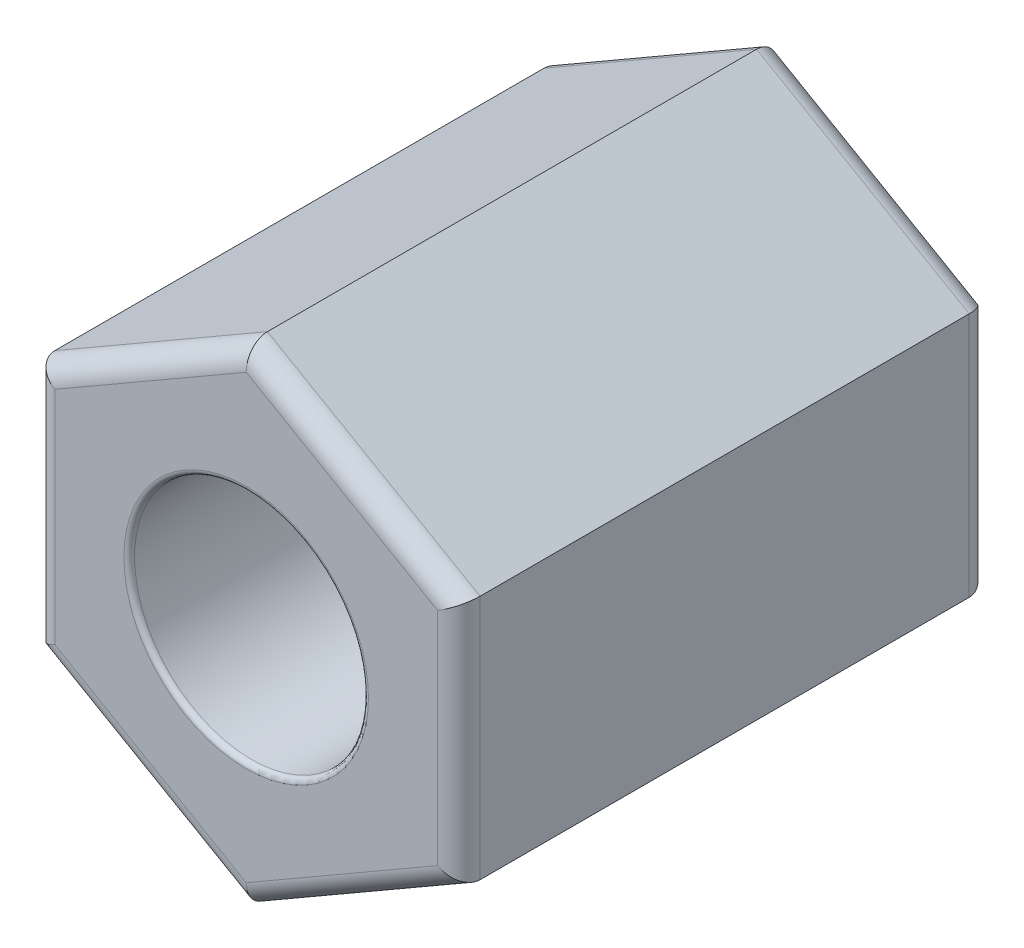
ISO-10303-21;
HEADER;
FILE_DESCRIPTION(('STEP AP214'),'2;1');
FILE_NAME('part.step','',(''),(''),'','','');
FILE_SCHEMA(('AUTOMOTIVE_DESIGN { 1 0 10303 214 1 1 1 1 }'));
ENDSEC;
DATA;
#1=APPLICATION_CONTEXT('core data for automotive mechanical design processes');
#2=APPLICATION_PROTOCOL_DEFINITION('international standard','automotive_design',2000,#1);
#3=PRODUCT_CONTEXT('',#1,'mechanical');
#4=PRODUCT('Part','Part','',(#3));
#5=PRODUCT_RELATED_PRODUCT_CATEGORY('part','',(#4));
#6=PRODUCT_DEFINITION_FORMATION('','',#4);
#7=PRODUCT_DEFINITION_CONTEXT('part definition',#1,'design');
#8=PRODUCT_DEFINITION('design','',#6,#7);
#9=PRODUCT_DEFINITION_SHAPE('','',#8);
#10=(LENGTH_UNIT() NAMED_UNIT(*) SI_UNIT(.MILLI.,.METRE.));
#11=(NAMED_UNIT(*) PLANE_ANGLE_UNIT() SI_UNIT($,.RADIAN.));
#12=(NAMED_UNIT(*) SI_UNIT($,.STERADIAN.) SOLID_ANGLE_UNIT());
#13=UNCERTAINTY_MEASURE_WITH_UNIT(LENGTH_MEASURE(1.E-05),#10,'distance_accuracy_value','');
#14=(GEOMETRIC_REPRESENTATION_CONTEXT(3) GLOBAL_UNCERTAINTY_ASSIGNED_CONTEXT((#13)) GLOBAL_UNIT_ASSIGNED_CONTEXT((#10,
#11,#12)) REPRESENTATION_CONTEXT('',''));
#15=CARTESIAN_POINT('',(0.,0.,0.));
#16=DIRECTION('',(0.,0.,1.));
#17=DIRECTION('',(1.,0.,0.));
#18=AXIS2_PLACEMENT_3D('',#15,#16,#17);
#19=CARTESIAN_POINT('',(0.,0.,50.));
#20=DIRECTION('',(0.,0.,1.));
#21=DIRECTION('',(1.,0.,0.));
#22=AXIS2_PLACEMENT_3D('',#19,#20,#21);
#23=PLANE('',#22);
#24=CARTESIAN_POINT('',(0.,0.,50.));
#25=DIRECTION('',(0.,0.,1.));
#26=DIRECTION('',(1.,0.,0.));
#27=AXIS2_PLACEMENT_3D('',#24,#25,#26);
#28=CIRCLE('',#27,11.5);
#29=CARTESIAN_POINT('',(11.5,0.,50.));
#30=VERTEX_POINT('',#29);
#31=EDGE_CURVE('E11',#30,#30,#28,.F.);
#32=ORIENTED_EDGE('',*,*,#31,.T.);
#33=EDGE_LOOP('',(#32));
#34=FACE_BOUND('',#33,.T.);
#35=DIRECTION('',(0.866025403784439,0.5,0.));
#36=VECTOR('',#35,1.);
#37=CARTESIAN_POINT('',(19.,-9.81495457622363,50.));
#38=LINE('',#37,#36);
#39=CARTESIAN_POINT('',(0.,-20.7846096908265,50.));
#40=VERTEX_POINT('',#39);
#41=CARTESIAN_POINT('',(18.,-10.3923048454133,50.));
#42=VERTEX_POINT('',#41);
#43=EDGE_CURVE('E49',#40,#42,#38,.T.);
#44=ORIENTED_EDGE('',*,*,#43,.T.);
#45=DIRECTION('',(0.,1.,0.));
#46=VECTOR('',#45,1.);
#47=CARTESIAN_POINT('',(18.,11.5470053837925,50.));
#48=LINE('',#47,#46);
#49=CARTESIAN_POINT('',(18.,10.3923048454133,50.));
#50=VERTEX_POINT('',#49);
#51=EDGE_CURVE('E129',#42,#50,#48,.T.);
#52=ORIENTED_EDGE('',*,*,#51,.T.);
#53=DIRECTION('',(-0.866025403784438,0.5,0.));
#54=VECTOR('',#53,1.);
#55=CARTESIAN_POINT('',(-0.999999999999987,21.3619599600162,50.));
#56=LINE('',#55,#54);
#57=CARTESIAN_POINT('',(0.,20.7846096908265,50.));
#58=VERTEX_POINT('',#57);
#59=EDGE_CURVE('E194',#50,#58,#56,.T.);
#60=ORIENTED_EDGE('',*,*,#59,.T.);
#61=DIRECTION('',(-0.866025403784439,-0.5,0.));
#62=VECTOR('',#61,1.);
#63=CARTESIAN_POINT('',(-19.,9.81495457622363,50.));
#64=LINE('',#63,#62);
#65=CARTESIAN_POINT('',(-18.,10.3923048454133,50.));
#66=VERTEX_POINT('',#65);
#67=EDGE_CURVE('E196',#58,#66,#64,.T.);
#68=ORIENTED_EDGE('',*,*,#67,.T.);
#69=DIRECTION('',(0.,-1.,0.));
#70=VECTOR('',#69,1.);
#71=CARTESIAN_POINT('',(-18.,-11.5470053837925,50.));
#72=LINE('',#71,#70);
#73=CARTESIAN_POINT('',(-18.,-10.3923048454133,50.));
#74=VERTEX_POINT('',#73);
#75=EDGE_CURVE('E198',#66,#74,#72,.T.);
#76=ORIENTED_EDGE('',*,*,#75,.T.);
#77=DIRECTION('',(0.866025403784439,-0.5,0.));
#78=VECTOR('',#77,1.);
#79=CARTESIAN_POINT('',(0.999999999999984,-21.3619599600162,50.));
#80=LINE('',#79,#78);
#81=EDGE_CURVE('E54',#74,#40,#80,.T.);
#82=ORIENTED_EDGE('',*,*,#81,.T.);
#83=EDGE_LOOP('',(#44,#52,#60,#68,#76,#82));
#84=FACE_BOUND('',#83,.T.);
#85=ADVANCED_FACE('F34',(#34,#84),#23,.T.);
#86=CARTESIAN_POINT('',(0.,0.,0.));
#87=DIRECTION('',(0.,0.,1.));
#88=DIRECTION('',(1.,0.,0.));
#89=AXIS2_PLACEMENT_3D('',#86,#87,#88);
#90=PLANE('',#89);
#91=CARTESIAN_POINT('',(0.,0.,0.));
#92=DIRECTION('',(0.,0.,1.));
#93=DIRECTION('',(1.,0.,0.));
#94=AXIS2_PLACEMENT_3D('',#91,#92,#93);
#95=CIRCLE('',#94,11.5);
#96=CARTESIAN_POINT('',(11.5,0.,0.));
#97=VERTEX_POINT('',#96);
#98=EDGE_CURVE('E203',#97,#97,#95,.T.);
#99=ORIENTED_EDGE('',*,*,#98,.T.);
#100=EDGE_LOOP('',(#99));
#101=FACE_BOUND('',#100,.T.);
#102=DIRECTION('',(0.,1.,0.));
#103=VECTOR('',#102,1.);
#104=CARTESIAN_POINT('',(18.,0.,0.));
#105=LINE('',#104,#103);
#106=CARTESIAN_POINT('',(18.,10.3923048454133,0.));
#107=VERTEX_POINT('',#106);
#108=CARTESIAN_POINT('',(18.,-10.3923048454133,0.));
#109=VERTEX_POINT('',#108);
#110=EDGE_CURVE('E165',#107,#109,#105,.F.);
#111=ORIENTED_EDGE('',*,*,#110,.T.);
#112=DIRECTION('',(0.866025403784439,0.5,0.));
#113=VECTOR('',#112,1.);
#114=CARTESIAN_POINT('',(9.00000000000001,-15.5884572681199,0.));
#115=LINE('',#114,#113);
#116=CARTESIAN_POINT('',(0.,-20.7846096908265,0.));
#117=VERTEX_POINT('',#116);
#118=EDGE_CURVE('E175',#109,#117,#115,.F.);
#119=ORIENTED_EDGE('',*,*,#118,.T.);
#120=DIRECTION('',(0.866025403784439,-0.5,0.));
#121=VECTOR('',#120,1.);
#122=CARTESIAN_POINT('',(-9.00000000000001,-15.5884572681199,0.));
#123=LINE('',#122,#121);
#124=CARTESIAN_POINT('',(-18.,-10.3923048454133,0.));
#125=VERTEX_POINT('',#124);
#126=EDGE_CURVE('E173',#117,#125,#123,.F.);
#127=ORIENTED_EDGE('',*,*,#126,.T.);
#128=DIRECTION('',(0.,-1.,0.));
#129=VECTOR('',#128,1.);
#130=CARTESIAN_POINT('',(-18.,0.,0.));
#131=LINE('',#130,#129);
#132=CARTESIAN_POINT('',(-18.,10.3923048454133,0.));
#133=VERTEX_POINT('',#132);
#134=EDGE_CURVE('E171',#125,#133,#131,.F.);
#135=ORIENTED_EDGE('',*,*,#134,.T.);
#136=DIRECTION('',(-0.866025403784439,-0.5,0.));
#137=VECTOR('',#136,1.);
#138=CARTESIAN_POINT('',(-9.00000000000001,15.5884572681199,0.));
#139=LINE('',#138,#137);
#140=CARTESIAN_POINT('',(0.,20.7846096908265,0.));
#141=VERTEX_POINT('',#140);
#142=EDGE_CURVE('E169',#133,#141,#139,.F.);
#143=ORIENTED_EDGE('',*,*,#142,.T.);
#144=DIRECTION('',(-0.866025403784438,0.5,0.));
#145=VECTOR('',#144,1.);
#146=CARTESIAN_POINT('',(9.00000000000001,15.5884572681199,0.));
#147=LINE('',#146,#145);
#148=EDGE_CURVE('E167',#141,#107,#147,.F.);
#149=ORIENTED_EDGE('',*,*,#148,.T.);
#150=EDGE_LOOP('',(#111,#119,#127,#135,#143,#149));
#151=FACE_BOUND('',#150,.T.);
#152=ADVANCED_FACE('F246',(#101,#151),#90,.F.);
#153=CARTESIAN_POINT('',(-20.,-11.5470053837925,50.));
#154=DIRECTION('',(0.5,0.866025403784439,0.));
#155=DIRECTION('',(-0.866025403784439,0.5,0.));
#156=AXIS2_PLACEMENT_3D('',#153,#154,#155);
#157=PLANE('',#156);
#158=DIRECTION('',(0.,0.,-1.));
#159=VECTOR('',#158,1.);
#160=CARTESIAN_POINT('',(-20.,-11.5470053837925,50.));
#161=LINE('',#160,#159);
#162=CARTESIAN_POINT('',(-20.,-11.5470053837925,48.));
#163=VERTEX_POINT('',#162);
#164=CARTESIAN_POINT('',(-20.,-11.5470053837925,2.));
#165=VERTEX_POINT('',#164);
#166=EDGE_CURVE('E221',#163,#165,#161,.T.);
#167=ORIENTED_EDGE('',*,*,#166,.T.);
#168=DIRECTION('',(0.866025403784439,-0.5,0.));
#169=VECTOR('',#168,1.);
#170=CARTESIAN_POINT('',(-20.,-11.5470053837925,2.));
#171=LINE('',#170,#169);
#172=CARTESIAN_POINT('',(0.,-23.094010767585,2.));
#173=VERTEX_POINT('',#172);
#174=EDGE_CURVE('E180',#165,#173,#171,.T.);
#175=ORIENTED_EDGE('',*,*,#174,.T.);
#176=DIRECTION('',(0.,0.,-1.));
#177=VECTOR('',#176,1.);
#178=CARTESIAN_POINT('',(0.,-23.094010767585,50.));
#179=LINE('',#178,#177);
#180=CARTESIAN_POINT('',(0.,-23.094010767585,48.));
#181=VERTEX_POINT('',#180);
#182=EDGE_CURVE('E143',#181,#173,#179,.T.);
#183=ORIENTED_EDGE('',*,*,#182,.F.);
#184=DIRECTION('',(0.866025403784439,-0.5,0.));
#185=VECTOR('',#184,1.);
#186=CARTESIAN_POINT('',(-20.,-11.5470053837925,48.));
#187=LINE('',#186,#185);
#188=EDGE_CURVE('E178',#181,#163,#187,.F.);
#189=ORIENTED_EDGE('',*,*,#188,.T.);
#190=EDGE_LOOP('',(#167,#175,#183,#189));
#191=FACE_BOUND('',#190,.T.);
#192=ADVANCED_FACE('F249',(#191),#157,.F.);
#193=CARTESIAN_POINT('',(0.,-23.094010767585,50.));
#194=DIRECTION('',(-0.5,0.866025403784438,0.));
#195=DIRECTION('',(-0.866025403784439,-0.5,0.));
#196=AXIS2_PLACEMENT_3D('',#193,#194,#195);
#197=PLANE('',#196);
#198=ORIENTED_EDGE('',*,*,#182,.T.);
#199=DIRECTION('',(0.866025403784439,0.5,0.));
#200=VECTOR('',#199,1.);
#201=CARTESIAN_POINT('',(0.,-23.094010767585,2.));
#202=LINE('',#201,#200);
#203=CARTESIAN_POINT('',(20.,-11.5470053837925,2.));
#204=VERTEX_POINT('',#203);
#205=EDGE_CURVE('E142',#173,#204,#202,.T.);
#206=ORIENTED_EDGE('',*,*,#205,.T.);
#207=DIRECTION('',(0.,0.,-1.));
#208=VECTOR('',#207,1.);
#209=CARTESIAN_POINT('',(20.,-11.5470053837925,50.));
#210=LINE('',#209,#208);
#211=CARTESIAN_POINT('',(20.,-11.5470053837925,48.));
#212=VERTEX_POINT('',#211);
#213=EDGE_CURVE('E149',#212,#204,#210,.T.);
#214=ORIENTED_EDGE('',*,*,#213,.F.);
#215=DIRECTION('',(0.866025403784439,0.5,0.));
#216=VECTOR('',#215,1.);
#217=CARTESIAN_POINT('',(0.,-23.094010767585,48.));
#218=LINE('',#217,#216);
#219=EDGE_CURVE('E135',#212,#181,#218,.F.);
#220=ORIENTED_EDGE('',*,*,#219,.T.);
#221=EDGE_LOOP('',(#198,#206,#214,#220));
#222=FACE_BOUND('',#221,.T.);
#223=ADVANCED_FACE('F156',(#222),#197,.F.);
#224=CARTESIAN_POINT('',(20.,-11.5470053837925,50.));
#225=DIRECTION('',(-1.,0.,0.));
#226=DIRECTION('',(0.,-1.,0.));
#227=AXIS2_PLACEMENT_3D('',#224,#225,#226);
#228=PLANE('',#227);
#229=ORIENTED_EDGE('',*,*,#213,.T.);
#230=DIRECTION('',(0.,1.,0.));
#231=VECTOR('',#230,1.);
#232=CARTESIAN_POINT('',(20.,-11.5470053837925,2.));
#233=LINE('',#232,#231);
#234=CARTESIAN_POINT('',(20.,11.5470053837925,2.));
#235=VERTEX_POINT('',#234);
#236=EDGE_CURVE('E152',#204,#235,#233,.T.);
#237=ORIENTED_EDGE('',*,*,#236,.T.);
#238=DIRECTION('',(0.,0.,-1.));
#239=VECTOR('',#238,1.);
#240=CARTESIAN_POINT('',(20.,11.5470053837925,50.));
#241=LINE('',#240,#239);
#242=CARTESIAN_POINT('',(20.,11.5470053837925,48.));
#243=VERTEX_POINT('',#242);
#244=EDGE_CURVE('E151',#243,#235,#241,.T.);
#245=ORIENTED_EDGE('',*,*,#244,.F.);
#246=DIRECTION('',(0.,1.,0.));
#247=VECTOR('',#246,1.);
#248=CARTESIAN_POINT('',(20.,-11.5470053837925,48.));
#249=LINE('',#248,#247);
#250=EDGE_CURVE('E127',#243,#212,#249,.F.);
#251=ORIENTED_EDGE('',*,*,#250,.T.);
#252=EDGE_LOOP('',(#229,#237,#245,#251));
#253=FACE_BOUND('',#252,.T.);
#254=ADVANCED_FACE('F148',(#253),#228,.F.);
#255=CARTESIAN_POINT('',(20.,11.5470053837925,50.));
#256=DIRECTION('',(-0.5,-0.866025403784438,0.));
#257=DIRECTION('',(0.866025403784438,-0.5,0.));
#258=AXIS2_PLACEMENT_3D('',#255,#256,#257);
#259=PLANE('',#258);
#260=ORIENTED_EDGE('',*,*,#244,.T.);
#261=DIRECTION('',(-0.866025403784438,0.5,0.));
#262=VECTOR('',#261,1.);
#263=CARTESIAN_POINT('',(20.,11.5470053837925,2.));
#264=LINE('',#263,#262);
#265=CARTESIAN_POINT('',(0.,23.0940107675851,2.));
#266=VERTEX_POINT('',#265);
#267=EDGE_CURVE('E153',#235,#266,#264,.T.);
#268=ORIENTED_EDGE('',*,*,#267,.T.);
#269=DIRECTION('',(0.,0.,-1.));
#270=VECTOR('',#269,1.);
#271=CARTESIAN_POINT('',(0.,23.0940107675851,50.));
#272=LINE('',#271,#270);
#273=CARTESIAN_POINT('',(0.,23.0940107675851,48.));
#274=VERTEX_POINT('',#273);
#275=EDGE_CURVE('E160',#274,#266,#272,.T.);
#276=ORIENTED_EDGE('',*,*,#275,.F.);
#277=DIRECTION('',(-0.866025403784438,0.5,0.));
#278=VECTOR('',#277,1.);
#279=CARTESIAN_POINT('',(20.,11.5470053837925,48.));
#280=LINE('',#279,#278);
#281=EDGE_CURVE('E190',#274,#243,#280,.F.);
#282=ORIENTED_EDGE('',*,*,#281,.T.);
#283=EDGE_LOOP('',(#260,#268,#276,#282));
#284=FACE_BOUND('',#283,.T.);
#285=ADVANCED_FACE('F265',(#284),#259,.F.);
#286=CARTESIAN_POINT('',(0.,23.0940107675851,50.));
#287=DIRECTION('',(0.5,-0.866025403784439,0.));
#288=DIRECTION('',(0.866025403784439,0.5,0.));
#289=AXIS2_PLACEMENT_3D('',#286,#287,#288);
#290=PLANE('',#289);
#291=ORIENTED_EDGE('',*,*,#275,.T.);
#292=DIRECTION('',(-0.866025403784439,-0.5,0.));
#293=VECTOR('',#292,1.);
#294=CARTESIAN_POINT('',(0.,23.0940107675851,2.));
#295=LINE('',#294,#293);
#296=CARTESIAN_POINT('',(-20.,11.5470053837925,2.));
#297=VERTEX_POINT('',#296);
#298=EDGE_CURVE('E188',#266,#297,#295,.T.);
#299=ORIENTED_EDGE('',*,*,#298,.T.);
#300=DIRECTION('',(0.,0.,-1.));
#301=VECTOR('',#300,1.);
#302=CARTESIAN_POINT('',(-20.,11.5470053837925,50.));
#303=LINE('',#302,#301);
#304=CARTESIAN_POINT('',(-20.,11.5470053837925,48.));
#305=VERTEX_POINT('',#304);
#306=EDGE_CURVE('E282',#305,#297,#303,.T.);
#307=ORIENTED_EDGE('',*,*,#306,.F.);
#308=DIRECTION('',(-0.866025403784439,-0.5,0.));
#309=VECTOR('',#308,1.);
#310=CARTESIAN_POINT('',(0.,23.0940107675851,48.));
#311=LINE('',#310,#309);
#312=EDGE_CURVE('E186',#305,#274,#311,.F.);
#313=ORIENTED_EDGE('',*,*,#312,.T.);
#314=EDGE_LOOP('',(#291,#299,#307,#313));
#315=FACE_BOUND('',#314,.T.);
#316=ADVANCED_FACE('F281',(#315),#290,.F.);
#317=CARTESIAN_POINT('',(-20.,11.5470053837925,50.));
#318=DIRECTION('',(1.,0.,0.));
#319=DIRECTION('',(0.,0.,-1.));
#320=AXIS2_PLACEMENT_3D('',#317,#318,#319);
#321=PLANE('',#320);
#322=ORIENTED_EDGE('',*,*,#306,.T.);
#323=DIRECTION('',(0.,-1.,0.));
#324=VECTOR('',#323,1.);
#325=CARTESIAN_POINT('',(-20.,11.5470053837925,2.));
#326=LINE('',#325,#324);
#327=EDGE_CURVE('E184',#297,#165,#326,.T.);
#328=ORIENTED_EDGE('',*,*,#327,.T.);
#329=ORIENTED_EDGE('',*,*,#166,.F.);
#330=DIRECTION('',(0.,-1.,0.));
#331=VECTOR('',#330,1.);
#332=CARTESIAN_POINT('',(-20.,11.5470053837925,48.));
#333=LINE('',#332,#331);
#334=EDGE_CURVE('E182',#163,#305,#333,.F.);
#335=ORIENTED_EDGE('',*,*,#334,.T.);
#336=EDGE_LOOP('',(#322,#328,#329,#335));
#337=FACE_BOUND('',#336,.T.);
#338=ADVANCED_FACE('F285',(#337),#321,.F.);
#339=CARTESIAN_POINT('',(0.,0.,50.));
#340=DIRECTION('',(0.,0.,-1.));
#341=DIRECTION('',(-1.,0.,0.));
#342=AXIS2_PLACEMENT_3D('',#339,#340,#341);
#343=CYLINDRICAL_SURFACE('',#342,11.);
#344=CARTESIAN_POINT('',(0.,0.,0.5));
#345=DIRECTION('',(0.,0.,1.));
#346=DIRECTION('',(1.,0.,0.));
#347=AXIS2_PLACEMENT_3D('',#344,#345,#346);
#348=CIRCLE('',#347,11.);
#349=CARTESIAN_POINT('',(11.,0.,0.5));
#350=VERTEX_POINT('',#349);
#351=EDGE_CURVE('E42',#350,#350,#348,.F.);
#352=ORIENTED_EDGE('',*,*,#351,.T.);
#353=EDGE_LOOP('',(#352));
#354=FACE_BOUND('',#353,.T.);
#355=CARTESIAN_POINT('',(0.,0.,49.5));
#356=DIRECTION('',(0.,0.,1.));
#357=DIRECTION('',(1.,0.,0.));
#358=AXIS2_PLACEMENT_3D('',#355,#356,#357);
#359=CIRCLE('',#358,11.);
#360=CARTESIAN_POINT('',(11.,0.,49.5));
#361=VERTEX_POINT('',#360);
#362=EDGE_CURVE('E233',#361,#361,#359,.T.);
#363=ORIENTED_EDGE('',*,*,#362,.T.);
#364=EDGE_LOOP('',(#363));
#365=FACE_BOUND('',#364,.T.);
#366=ADVANCED_FACE('F238',(#354,#365),#343,.F.);
#367=CARTESIAN_POINT('',(1.00000000000001,21.3619599600162,2.));
#368=DIRECTION('',(-0.866025403784439,-0.5,0.));
#369=DIRECTION('',(0.5,-0.866025403784439,0.));
#370=AXIS2_PLACEMENT_3D('',#367,#368,#369);
#371=CYLINDRICAL_SURFACE('',#370,2.);
#372=CARTESIAN_POINT('',(0.,20.7846096908265,2.));
#373=DIRECTION('',(-1.,0.,0.));
#374=DIRECTION('',(0.,1.,0.));
#375=AXIS2_PLACEMENT_3D('',#372,#373,#374);
#376=ELLIPSE('',#375,2.3094010767585,2.);
#377=EDGE_CURVE('E215',#141,#266,#376,.F.);
#378=ORIENTED_EDGE('',*,*,#377,.F.);
#379=ORIENTED_EDGE('',*,*,#142,.F.);
#380=CARTESIAN_POINT('',(-18.,10.3923048454133,2.));
#381=DIRECTION('',(-0.5,-0.866025403784439,0.));
#382=DIRECTION('',(-0.866025403784439,0.5,0.));
#383=AXIS2_PLACEMENT_3D('',#380,#381,#382);
#384=ELLIPSE('',#383,2.3094010767585,2.);
#385=EDGE_CURVE('E218',#297,#133,#384,.T.);
#386=ORIENTED_EDGE('',*,*,#385,.F.);
#387=ORIENTED_EDGE('',*,*,#298,.F.);
#388=EDGE_LOOP('',(#378,#379,#386,#387));
#389=FACE_BOUND('',#388,.T.);
#390=ADVANCED_FACE('F275',(#389),#371,.T.);
#391=CARTESIAN_POINT('',(-18.,11.5470053837925,2.));
#392=DIRECTION('',(0.,-1.,0.));
#393=DIRECTION('',(0.,0.,-1.));
#394=AXIS2_PLACEMENT_3D('',#391,#392,#393);
#395=CYLINDRICAL_SURFACE('',#394,2.);
#396=ORIENTED_EDGE('',*,*,#385,.T.);
#397=ORIENTED_EDGE('',*,*,#134,.F.);
#398=CARTESIAN_POINT('',(-18.,-10.3923048454133,2.));
#399=DIRECTION('',(0.5,-0.866025403784439,0.));
#400=DIRECTION('',(-0.866025403784439,-0.5,0.));
#401=AXIS2_PLACEMENT_3D('',#398,#399,#400);
#402=ELLIPSE('',#401,2.3094010767585,2.);
#403=EDGE_CURVE('E212',#165,#125,#402,.T.);
#404=ORIENTED_EDGE('',*,*,#403,.F.);
#405=ORIENTED_EDGE('',*,*,#327,.F.);
#406=EDGE_LOOP('',(#396,#397,#404,#405));
#407=FACE_BOUND('',#406,.T.);
#408=ADVANCED_FACE('F297',(#407),#395,.T.);
#409=CARTESIAN_POINT('',(19.,9.81495457622366,2.));
#410=DIRECTION('',(-0.866025403784438,0.5,0.));
#411=DIRECTION('',(-0.5,-0.866025403784438,0.));
#412=AXIS2_PLACEMENT_3D('',#409,#410,#411);
#413=CYLINDRICAL_SURFACE('',#412,2.);
#414=ORIENTED_EDGE('',*,*,#377,.T.);
#415=ORIENTED_EDGE('',*,*,#267,.F.);
#416=CARTESIAN_POINT('',(18.,10.3923048454133,2.));
#417=DIRECTION('',(-0.5,0.866025403784439,0.));
#418=DIRECTION('',(0.866025403784439,0.5,0.));
#419=AXIS2_PLACEMENT_3D('',#416,#417,#418);
#420=ELLIPSE('',#419,2.3094010767585,2.);
#421=EDGE_CURVE('E209',#107,#235,#420,.F.);
#422=ORIENTED_EDGE('',*,*,#421,.F.);
#423=ORIENTED_EDGE('',*,*,#148,.F.);
#424=EDGE_LOOP('',(#414,#415,#422,#423));
#425=FACE_BOUND('',#424,.T.);
#426=ADVANCED_FACE('F270',(#425),#413,.T.);
#427=CARTESIAN_POINT('',(-19.,-9.81495457622364,2.));
#428=DIRECTION('',(0.866025403784439,-0.5,0.));
#429=DIRECTION('',(0.5,0.866025403784439,0.));
#430=AXIS2_PLACEMENT_3D('',#427,#428,#429);
#431=CYLINDRICAL_SURFACE('',#430,2.);
#432=ORIENTED_EDGE('',*,*,#403,.T.);
#433=ORIENTED_EDGE('',*,*,#126,.F.);
#434=CARTESIAN_POINT('',(0.,-20.7846096908265,2.));
#435=DIRECTION('',(1.,0.,0.));
#436=DIRECTION('',(0.,-1.,0.));
#437=AXIS2_PLACEMENT_3D('',#434,#435,#436);
#438=ELLIPSE('',#437,2.3094010767585,2.);
#439=EDGE_CURVE('E206',#173,#117,#438,.T.);
#440=ORIENTED_EDGE('',*,*,#439,.F.);
#441=ORIENTED_EDGE('',*,*,#174,.F.);
#442=EDGE_LOOP('',(#432,#433,#440,#441));
#443=FACE_BOUND('',#442,.T.);
#444=ADVANCED_FACE('F299',(#443),#431,.T.);
#445=CARTESIAN_POINT('',(18.,-11.5470053837925,2.));
#446=DIRECTION('',(0.,1.,0.));
#447=DIRECTION('',(-1.,0.,0.));
#448=AXIS2_PLACEMENT_3D('',#445,#446,#447);
#449=CYLINDRICAL_SURFACE('',#448,2.);
#450=ORIENTED_EDGE('',*,*,#421,.T.);
#451=ORIENTED_EDGE('',*,*,#236,.F.);
#452=CARTESIAN_POINT('',(18.,-10.3923048454133,2.));
#453=DIRECTION('',(0.5,0.866025403784439,0.));
#454=DIRECTION('',(-0.866025403784439,0.5,0.));
#455=AXIS2_PLACEMENT_3D('',#452,#453,#454);
#456=ELLIPSE('',#455,2.3094010767585,2.);
#457=EDGE_CURVE('E204',#109,#204,#456,.F.);
#458=ORIENTED_EDGE('',*,*,#457,.F.);
#459=ORIENTED_EDGE('',*,*,#110,.F.);
#460=EDGE_LOOP('',(#450,#451,#458,#459));
#461=FACE_BOUND('',#460,.T.);
#462=ADVANCED_FACE('F262',(#461),#449,.T.);
#463=CARTESIAN_POINT('',(-1.00000000000002,-21.3619599600162,2.));
#464=DIRECTION('',(0.866025403784439,0.5,0.));
#465=DIRECTION('',(-0.5,0.866025403784438,0.));
#466=AXIS2_PLACEMENT_3D('',#463,#464,#465);
#467=CYLINDRICAL_SURFACE('',#466,2.);
#468=ORIENTED_EDGE('',*,*,#439,.T.);
#469=ORIENTED_EDGE('',*,*,#118,.F.);
#470=ORIENTED_EDGE('',*,*,#457,.T.);
#471=ORIENTED_EDGE('',*,*,#205,.F.);
#472=EDGE_LOOP('',(#468,#469,#470,#471));
#473=FACE_BOUND('',#472,.T.);
#474=ADVANCED_FACE('F258',(#473),#467,.T.);
#475=CARTESIAN_POINT('',(-18.,0.,48.));
#476=DIRECTION('',(0.,1.,0.));
#477=DIRECTION('',(0.,0.,1.));
#478=AXIS2_PLACEMENT_3D('',#475,#476,#477);
#479=CYLINDRICAL_SURFACE('',#478,2.);
#480=CARTESIAN_POINT('',(-18.,10.3923048454133,48.));
#481=DIRECTION('',(0.5,0.866025403784439,0.));
#482=DIRECTION('',(0.866025403784439,-0.5,0.));
#483=AXIS2_PLACEMENT_3D('',#480,#481,#482);
#484=ELLIPSE('',#483,2.3094010767585,2.);
#485=EDGE_CURVE('E226',#305,#66,#484,.T.);
#486=ORIENTED_EDGE('',*,*,#485,.F.);
#487=ORIENTED_EDGE('',*,*,#334,.F.);
#488=CARTESIAN_POINT('',(-18.,-10.3923048454133,48.));
#489=DIRECTION('',(-0.5,0.866025403784439,0.));
#490=DIRECTION('',(0.866025403784439,0.5,0.));
#491=AXIS2_PLACEMENT_3D('',#488,#489,#490);
#492=ELLIPSE('',#491,2.3094010767585,2.);
#493=EDGE_CURVE('E207',#74,#163,#492,.F.);
#494=ORIENTED_EDGE('',*,*,#493,.F.);
#495=ORIENTED_EDGE('',*,*,#75,.F.);
#496=EDGE_LOOP('',(#486,#487,#494,#495));
#497=FACE_BOUND('',#496,.T.);
#498=ADVANCED_FACE('F328',(#497),#479,.T.);
#499=CARTESIAN_POINT('',(-9.00000000000001,-15.5884572681199,48.));
#500=DIRECTION('',(-0.866025403784439,0.5,0.));
#501=DIRECTION('',(-0.5,-0.866025403784439,0.));
#502=AXIS2_PLACEMENT_3D('',#499,#500,#501);
#503=CYLINDRICAL_SURFACE('',#502,2.);
#504=ORIENTED_EDGE('',*,*,#493,.T.);
#505=ORIENTED_EDGE('',*,*,#188,.F.);
#506=CARTESIAN_POINT('',(0.,-20.7846096908265,48.));
#507=DIRECTION('',(-1.,0.,0.));
#508=DIRECTION('',(0.,1.,0.));
#509=AXIS2_PLACEMENT_3D('',#506,#507,#508);
#510=ELLIPSE('',#509,2.3094010767585,2.);
#511=EDGE_CURVE('E137',#40,#181,#510,.F.);
#512=ORIENTED_EDGE('',*,*,#511,.F.);
#513=ORIENTED_EDGE('',*,*,#81,.F.);
#514=EDGE_LOOP('',(#504,#505,#512,#513));
#515=FACE_BOUND('',#514,.T.);
#516=ADVANCED_FACE('F332',(#515),#503,.T.);
#517=CARTESIAN_POINT('',(-9.00000000000001,15.5884572681199,48.));
#518=DIRECTION('',(0.866025403784439,0.5,0.));
#519=DIRECTION('',(-0.5,0.866025403784439,0.));
#520=AXIS2_PLACEMENT_3D('',#517,#518,#519);
#521=CYLINDRICAL_SURFACE('',#520,2.);
#522=ORIENTED_EDGE('',*,*,#485,.T.);
#523=ORIENTED_EDGE('',*,*,#67,.F.);
#524=CARTESIAN_POINT('',(0.,20.7846096908265,48.));
#525=DIRECTION('',(1.,0.,0.));
#526=DIRECTION('',(0.,-1.,0.));
#527=AXIS2_PLACEMENT_3D('',#524,#525,#526);
#528=ELLIPSE('',#527,2.3094010767585,2.);
#529=EDGE_CURVE('E131',#274,#58,#528,.T.);
#530=ORIENTED_EDGE('',*,*,#529,.F.);
#531=ORIENTED_EDGE('',*,*,#312,.F.);
#532=EDGE_LOOP('',(#522,#523,#530,#531));
#533=FACE_BOUND('',#532,.T.);
#534=ADVANCED_FACE('F338',(#533),#521,.T.);
#535=CARTESIAN_POINT('',(9.00000000000001,-15.5884572681199,48.));
#536=DIRECTION('',(-0.866025403784439,-0.5,0.));
#537=DIRECTION('',(0.5,-0.866025403784438,0.));
#538=AXIS2_PLACEMENT_3D('',#535,#536,#537);
#539=CYLINDRICAL_SURFACE('',#538,2.);
#540=ORIENTED_EDGE('',*,*,#511,.T.);
#541=ORIENTED_EDGE('',*,*,#219,.F.);
#542=CARTESIAN_POINT('',(18.,-10.3923048454133,48.));
#543=DIRECTION('',(-0.5,-0.866025403784439,0.));
#544=DIRECTION('',(-0.866025403784439,0.5,0.));
#545=AXIS2_PLACEMENT_3D('',#542,#543,#544);
#546=ELLIPSE('',#545,2.3094010767585,2.);
#547=EDGE_CURVE('E123',#42,#212,#546,.F.);
#548=ORIENTED_EDGE('',*,*,#547,.F.);
#549=ORIENTED_EDGE('',*,*,#43,.F.);
#550=EDGE_LOOP('',(#540,#541,#548,#549));
#551=FACE_BOUND('',#550,.T.);
#552=ADVANCED_FACE('F136',(#551),#539,.T.);
#553=CARTESIAN_POINT('',(9.00000000000001,15.5884572681199,48.));
#554=DIRECTION('',(0.866025403784438,-0.5,0.));
#555=DIRECTION('',(0.5,0.866025403784438,0.));
#556=AXIS2_PLACEMENT_3D('',#553,#554,#555);
#557=CYLINDRICAL_SURFACE('',#556,2.);
#558=ORIENTED_EDGE('',*,*,#529,.T.);
#559=ORIENTED_EDGE('',*,*,#59,.F.);
#560=CARTESIAN_POINT('',(18.,10.3923048454133,48.));
#561=DIRECTION('',(0.5,-0.866025403784439,0.));
#562=DIRECTION('',(0.866025403784439,0.5,0.));
#563=AXIS2_PLACEMENT_3D('',#560,#561,#562);
#564=ELLIPSE('',#563,2.3094010767585,2.);
#565=EDGE_CURVE('E132',#243,#50,#564,.T.);
#566=ORIENTED_EDGE('',*,*,#565,.F.);
#567=ORIENTED_EDGE('',*,*,#281,.F.);
#568=EDGE_LOOP('',(#558,#559,#566,#567));
#569=FACE_BOUND('',#568,.T.);
#570=ADVANCED_FACE('F347',(#569),#557,.T.);
#571=CARTESIAN_POINT('',(18.,0.,48.));
#572=DIRECTION('',(0.,-1.,0.));
#573=DIRECTION('',(1.,0.,0.));
#574=AXIS2_PLACEMENT_3D('',#571,#572,#573);
#575=CYLINDRICAL_SURFACE('',#574,2.);
#576=ORIENTED_EDGE('',*,*,#547,.T.);
#577=ORIENTED_EDGE('',*,*,#250,.F.);
#578=ORIENTED_EDGE('',*,*,#565,.T.);
#579=ORIENTED_EDGE('',*,*,#51,.F.);
#580=EDGE_LOOP('',(#576,#577,#578,#579));
#581=FACE_BOUND('',#580,.T.);
#582=ADVANCED_FACE('F125',(#581),#575,.T.);
#583=CARTESIAN_POINT('',(0.,0.,0.5));
#584=DIRECTION('',(0.,0.,1.));
#585=DIRECTION('',(1.,0.,0.));
#586=AXIS2_PLACEMENT_3D('',#583,#584,#585);
#587=TOROIDAL_SURFACE('',#586,11.5,0.5);
#588=ORIENTED_EDGE('',*,*,#351,.F.);
#589=EDGE_LOOP('',(#588));
#590=FACE_BOUND('',#589,.T.);
#591=ORIENTED_EDGE('',*,*,#98,.F.);
#592=EDGE_LOOP('',(#591));
#593=FACE_BOUND('',#592,.T.);
#594=ADVANCED_FACE('F241',(#590,#593),#587,.T.);
#595=CARTESIAN_POINT('',(0.,0.,49.5));
#596=DIRECTION('',(0.,0.,1.));
#597=DIRECTION('',(1.,0.,0.));
#598=AXIS2_PLACEMENT_3D('',#595,#596,#597);
#599=TOROIDAL_SURFACE('',#598,11.5,0.5);
#600=ORIENTED_EDGE('',*,*,#31,.F.);
#601=EDGE_LOOP('',(#600));
#602=FACE_BOUND('',#601,.T.);
#603=ORIENTED_EDGE('',*,*,#362,.F.);
#604=EDGE_LOOP('',(#603));
#605=FACE_BOUND('',#604,.T.);
#606=ADVANCED_FACE('F36',(#602,#605),#599,.T.);
#607=CLOSED_SHELL('',(#85,#152,#192,#223,#254,#285,#316,#338,#366,#390,#408,#426,#444,#462,#474,
#498,#516,#534,#552,#570,#582,#594,#606));
#608=MANIFOLD_SOLID_BREP('B2',#607);
#609=ADVANCED_BREP_SHAPE_REPRESENTATION('',(#18,#608),#14);
#610=SHAPE_DEFINITION_REPRESENTATION(#9,#609);
ENDSEC;
END-ISO-10303-21;
